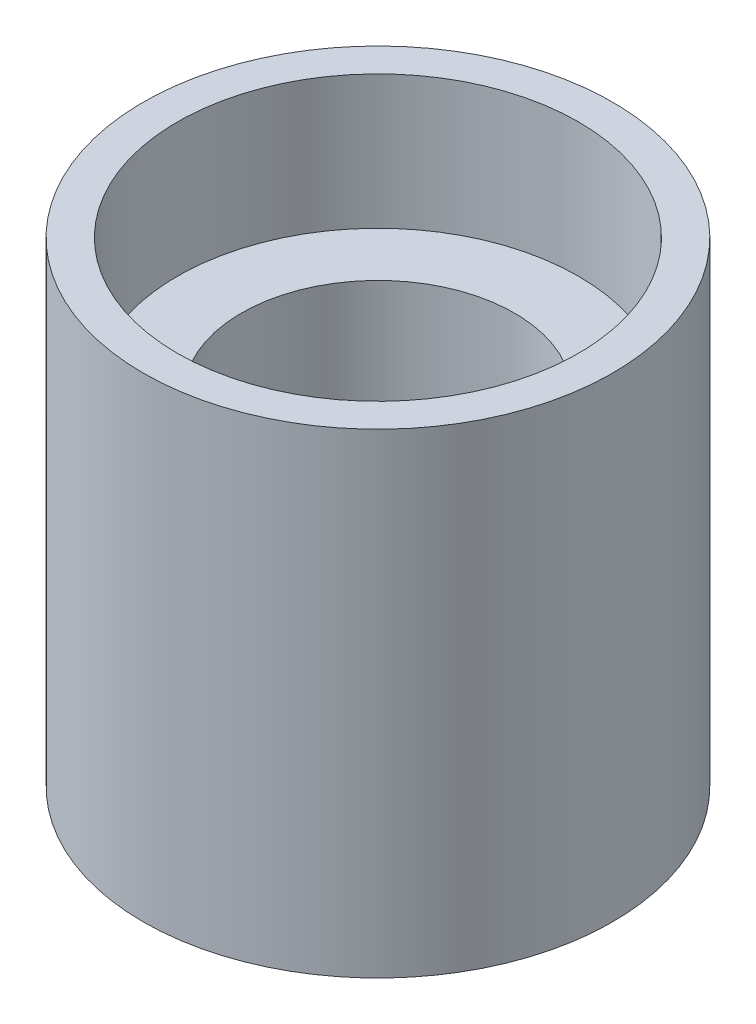
ISO-10303-21;
HEADER;
FILE_DESCRIPTION(('STEP AP214'),'2;1');
FILE_NAME('part.step','',(''),(''),'','','');
FILE_SCHEMA(('AUTOMOTIVE_DESIGN { 1 0 10303 214 1 1 1 1 }'));
ENDSEC;
DATA;
#1=APPLICATION_CONTEXT('core data for automotive mechanical design processes');
#2=APPLICATION_PROTOCOL_DEFINITION('international standard','automotive_design',2000,#1);
#3=PRODUCT_CONTEXT('',#1,'mechanical');
#4=PRODUCT('Part','Part','',(#3));
#5=PRODUCT_RELATED_PRODUCT_CATEGORY('part','',(#4));
#6=PRODUCT_DEFINITION_FORMATION('','',#4);
#7=PRODUCT_DEFINITION_CONTEXT('part definition',#1,'design');
#8=PRODUCT_DEFINITION('design','',#6,#7);
#9=PRODUCT_DEFINITION_SHAPE('','',#8);
#10=(LENGTH_UNIT() NAMED_UNIT(*) SI_UNIT(.MILLI.,.METRE.));
#11=(NAMED_UNIT(*) PLANE_ANGLE_UNIT() SI_UNIT($,.RADIAN.));
#12=(NAMED_UNIT(*) SI_UNIT($,.STERADIAN.) SOLID_ANGLE_UNIT());
#13=UNCERTAINTY_MEASURE_WITH_UNIT(LENGTH_MEASURE(1.E-05),#10,'distance_accuracy_value','');
#14=(GEOMETRIC_REPRESENTATION_CONTEXT(3) GLOBAL_UNCERTAINTY_ASSIGNED_CONTEXT((#13)) GLOBAL_UNIT_ASSIGNED_CONTEXT((#10,
#11,#12)) REPRESENTATION_CONTEXT('',''));
#15=CARTESIAN_POINT('',(0.,0.,0.));
#16=DIRECTION('',(0.,0.,1.));
#17=DIRECTION('',(1.,0.,0.));
#18=AXIS2_PLACEMENT_3D('',#15,#16,#17);
#19=CARTESIAN_POINT('',(0.,16.,0.));
#20=DIRECTION('',(0.,-1.,0.));
#21=DIRECTION('',(0.,0.,-1.));
#22=AXIS2_PLACEMENT_3D('',#19,#20,#21);
#23=CYLINDRICAL_SURFACE('',#22,4.6);
#24=CARTESIAN_POINT('',(0.,0.,0.));
#25=DIRECTION('',(0.,1.,0.));
#26=DIRECTION('',(0.,0.,1.));
#27=AXIS2_PLACEMENT_3D('',#24,#25,#26);
#28=CIRCLE('',#27,4.6);
#29=CARTESIAN_POINT('',(0.,0.,4.6));
#30=VERTEX_POINT('',#29);
#31=EDGE_CURVE('E48',#30,#30,#28,.T.);
#32=ORIENTED_EDGE('',*,*,#31,.F.);
#33=EDGE_LOOP('',(#32));
#34=FACE_BOUND('',#33,.T.);
#35=CARTESIAN_POINT('',(0.,11.5,0.));
#36=DIRECTION('',(0.,1.,0.));
#37=DIRECTION('',(0.,0.,1.));
#38=AXIS2_PLACEMENT_3D('',#35,#36,#37);
#39=CIRCLE('',#38,4.6);
#40=CARTESIAN_POINT('',(0.,11.5,4.6));
#41=VERTEX_POINT('',#40);
#42=EDGE_CURVE('E39',#41,#41,#39,.T.);
#43=ORIENTED_EDGE('',*,*,#42,.T.);
#44=EDGE_LOOP('',(#43));
#45=FACE_BOUND('',#44,.T.);
#46=ADVANCED_FACE('F35',(#34,#45),#23,.F.);
#47=CARTESIAN_POINT('',(0.,16.,0.));
#48=DIRECTION('',(0.,1.,0.));
#49=DIRECTION('',(0.,0.,1.));
#50=AXIS2_PLACEMENT_3D('',#47,#48,#49);
#51=PLANE('',#50);
#52=CARTESIAN_POINT('',(0.,16.,0.));
#53=DIRECTION('',(0.,1.,0.));
#54=DIRECTION('',(0.,0.,1.));
#55=AXIS2_PLACEMENT_3D('',#52,#53,#54);
#56=CIRCLE('',#55,6.75);
#57=CARTESIAN_POINT('',(0.,16.,6.75));
#58=VERTEX_POINT('',#57);
#59=EDGE_CURVE('E52',#58,#58,#56,.T.);
#60=ORIENTED_EDGE('',*,*,#59,.F.);
#61=EDGE_LOOP('',(#60));
#62=FACE_BOUND('',#61,.T.);
#63=CARTESIAN_POINT('',(0.,16.,0.));
#64=DIRECTION('',(0.,1.,0.));
#65=DIRECTION('',(0.,0.,1.));
#66=AXIS2_PLACEMENT_3D('',#63,#64,#65);
#67=CIRCLE('',#66,7.9);
#68=CARTESIAN_POINT('',(0.,16.,7.9));
#69=VERTEX_POINT('',#68);
#70=EDGE_CURVE('E10',#69,#69,#67,.T.);
#71=ORIENTED_EDGE('',*,*,#70,.T.);
#72=EDGE_LOOP('',(#71));
#73=FACE_BOUND('',#72,.T.);
#74=ADVANCED_FACE('F73',(#62,#73),#51,.T.);
#75=CARTESIAN_POINT('',(0.,0.,0.));
#76=DIRECTION('',(0.,1.,0.));
#77=DIRECTION('',(0.,0.,1.));
#78=AXIS2_PLACEMENT_3D('',#75,#76,#77);
#79=PLANE('',#78);
#80=CARTESIAN_POINT('',(0.,0.,0.));
#81=DIRECTION('',(0.,1.,0.));
#82=DIRECTION('',(0.,0.,1.));
#83=AXIS2_PLACEMENT_3D('',#80,#81,#82);
#84=CIRCLE('',#83,7.9);
#85=CARTESIAN_POINT('',(0.,0.,7.9));
#86=VERTEX_POINT('',#85);
#87=EDGE_CURVE('E43',#86,#86,#84,.T.);
#88=ORIENTED_EDGE('',*,*,#87,.F.);
#89=EDGE_LOOP('',(#88));
#90=FACE_BOUND('',#89,.T.);
#91=ORIENTED_EDGE('',*,*,#31,.T.);
#92=EDGE_LOOP('',(#91));
#93=FACE_BOUND('',#92,.T.);
#94=ADVANCED_FACE('F79',(#90,#93),#79,.F.);
#95=CARTESIAN_POINT('',(0.,16.,0.));
#96=DIRECTION('',(0.,-1.,0.));
#97=DIRECTION('',(0.,0.,-1.));
#98=AXIS2_PLACEMENT_3D('',#95,#96,#97);
#99=CYLINDRICAL_SURFACE('',#98,7.9);
#100=ORIENTED_EDGE('',*,*,#70,.F.);
#101=EDGE_LOOP('',(#100));
#102=FACE_BOUND('',#101,.T.);
#103=ORIENTED_EDGE('',*,*,#87,.T.);
#104=EDGE_LOOP('',(#103));
#105=FACE_BOUND('',#104,.T.);
#106=ADVANCED_FACE('F37',(#102,#105),#99,.T.);
#107=CARTESIAN_POINT('',(0.,11.5,0.));
#108=DIRECTION('',(0.,1.,0.));
#109=DIRECTION('',(0.,0.,1.));
#110=AXIS2_PLACEMENT_3D('',#107,#108,#109);
#111=CYLINDRICAL_SURFACE('',#110,6.75);
#112=CARTESIAN_POINT('',(0.,11.5,0.));
#113=DIRECTION('',(0.,1.,0.));
#114=DIRECTION('',(0.,0.,1.));
#115=AXIS2_PLACEMENT_3D('',#112,#113,#114);
#116=CIRCLE('',#115,6.75);
#117=CARTESIAN_POINT('',(0.,11.5,6.75));
#118=VERTEX_POINT('',#117);
#119=EDGE_CURVE('E55',#118,#118,#116,.T.);
#120=ORIENTED_EDGE('',*,*,#119,.F.);
#121=EDGE_LOOP('',(#120));
#122=FACE_BOUND('',#121,.T.);
#123=ORIENTED_EDGE('',*,*,#59,.T.);
#124=EDGE_LOOP('',(#123));
#125=FACE_BOUND('',#124,.T.);
#126=ADVANCED_FACE('F65',(#122,#125),#111,.F.);
#127=CARTESIAN_POINT('',(0.,11.5,0.));
#128=DIRECTION('',(0.,1.,0.));
#129=DIRECTION('',(0.,0.,1.));
#130=AXIS2_PLACEMENT_3D('',#127,#128,#129);
#131=PLANE('',#130);
#132=ORIENTED_EDGE('',*,*,#42,.F.);
#133=EDGE_LOOP('',(#132));
#134=FACE_BOUND('',#133,.T.);
#135=ORIENTED_EDGE('',*,*,#119,.T.);
#136=EDGE_LOOP('',(#135));
#137=FACE_BOUND('',#136,.T.);
#138=ADVANCED_FACE('F63',(#134,#137),#131,.T.);
#139=CLOSED_SHELL('',(#46,#74,#94,#106,#126,#138));
#140=MANIFOLD_SOLID_BREP('B2',#139);
#141=ADVANCED_BREP_SHAPE_REPRESENTATION('',(#18,#140),#14);
#142=SHAPE_DEFINITION_REPRESENTATION(#9,#141);
ENDSEC;
END-ISO-10303-21;
